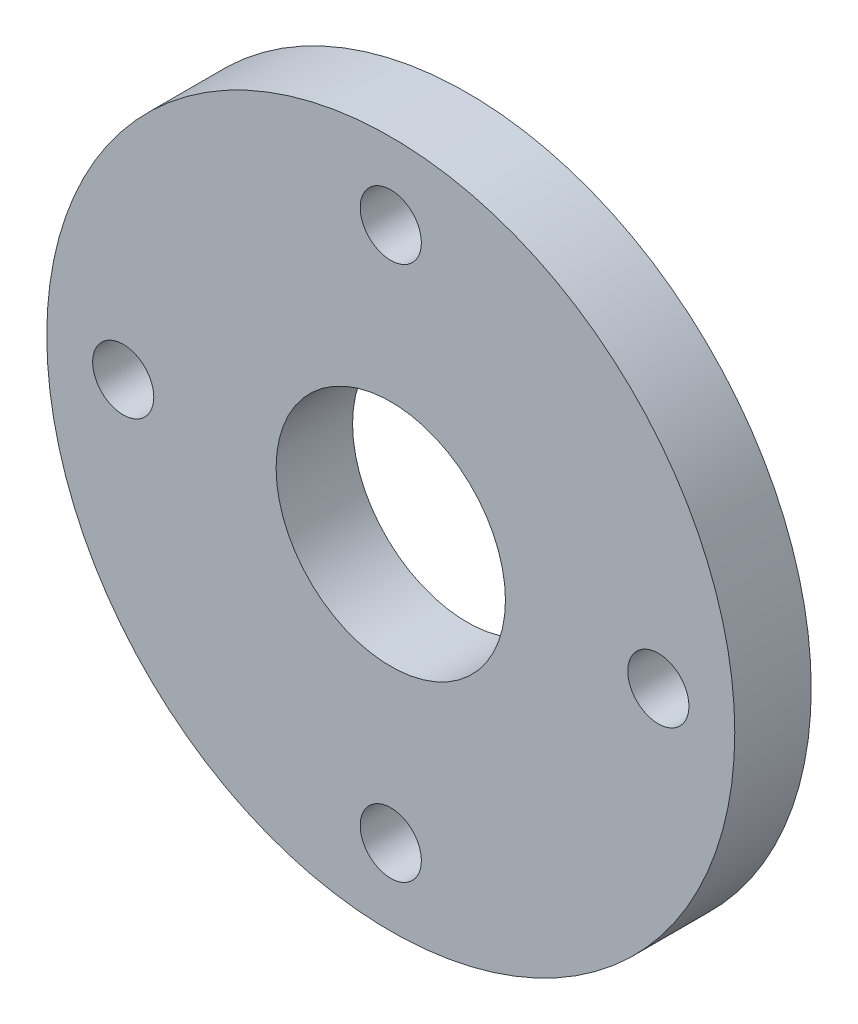
ISO-10303-21;
HEADER;
FILE_DESCRIPTION(('STEP AP214'),'2;1');
FILE_NAME('part.step','',(''),(''),'','','');
FILE_SCHEMA(('AUTOMOTIVE_DESIGN { 1 0 10303 214 1 1 1 1 }'));
ENDSEC;
DATA;
#1=APPLICATION_CONTEXT('core data for automotive mechanical design processes');
#2=APPLICATION_PROTOCOL_DEFINITION('international standard','automotive_design',2000,#1);
#3=PRODUCT_CONTEXT('',#1,'mechanical');
#4=PRODUCT('Part','Part','',(#3));
#5=PRODUCT_RELATED_PRODUCT_CATEGORY('part','',(#4));
#6=PRODUCT_DEFINITION_FORMATION('','',#4);
#7=PRODUCT_DEFINITION_CONTEXT('part definition',#1,'design');
#8=PRODUCT_DEFINITION('design','',#6,#7);
#9=PRODUCT_DEFINITION_SHAPE('','',#8);
#10=(LENGTH_UNIT() NAMED_UNIT(*) SI_UNIT(.MILLI.,.METRE.));
#11=(NAMED_UNIT(*) PLANE_ANGLE_UNIT() SI_UNIT($,.RADIAN.));
#12=(NAMED_UNIT(*) SI_UNIT($,.STERADIAN.) SOLID_ANGLE_UNIT());
#13=UNCERTAINTY_MEASURE_WITH_UNIT(LENGTH_MEASURE(1.E-05),#10,'distance_accuracy_value','');
#14=(GEOMETRIC_REPRESENTATION_CONTEXT(3) GLOBAL_UNCERTAINTY_ASSIGNED_CONTEXT((#13)) GLOBAL_UNIT_ASSIGNED_CONTEXT((#10,
#11,#12)) REPRESENTATION_CONTEXT('',''));
#15=CARTESIAN_POINT('',(0.,0.,0.));
#16=DIRECTION('',(0.,0.,1.));
#17=DIRECTION('',(1.,0.,0.));
#18=AXIS2_PLACEMENT_3D('',#15,#16,#17);
#19=CARTESIAN_POINT('',(0.,0.,5.));
#20=DIRECTION('',(0.,0.,-1.));
#21=DIRECTION('',(-1.,0.,0.));
#22=AXIS2_PLACEMENT_3D('',#19,#20,#21);
#23=CYLINDRICAL_SURFACE('',#22,22.5);
#24=CARTESIAN_POINT('',(0.,0.,5.));
#25=DIRECTION('',(0.,0.,1.));
#26=DIRECTION('',(1.,0.,0.));
#27=AXIS2_PLACEMENT_3D('',#24,#25,#26);
#28=CIRCLE('',#27,22.5);
#29=CARTESIAN_POINT('',(22.5,0.,5.));
#30=VERTEX_POINT('',#29);
#31=EDGE_CURVE('E10',#30,#30,#28,.T.);
#32=ORIENTED_EDGE('',*,*,#31,.F.);
#33=EDGE_LOOP('',(#32));
#34=FACE_BOUND('',#33,.T.);
#35=CARTESIAN_POINT('',(0.,0.,0.));
#36=DIRECTION('',(0.,0.,1.));
#37=DIRECTION('',(1.,0.,0.));
#38=AXIS2_PLACEMENT_3D('',#35,#36,#37);
#39=CIRCLE('',#38,22.5);
#40=CARTESIAN_POINT('',(22.5,0.,0.));
#41=VERTEX_POINT('',#40);
#42=EDGE_CURVE('E40',#41,#41,#39,.T.);
#43=ORIENTED_EDGE('',*,*,#42,.T.);
#44=EDGE_LOOP('',(#43));
#45=FACE_BOUND('',#44,.T.);
#46=ADVANCED_FACE('F37',(#34,#45),#23,.T.);
#47=CARTESIAN_POINT('',(0.,0.,5.));
#48=DIRECTION('',(0.,0.,1.));
#49=DIRECTION('',(1.,0.,0.));
#50=AXIS2_PLACEMENT_3D('',#47,#48,#49);
#51=PLANE('',#50);
#52=CARTESIAN_POINT('',(-17.5,0.,5.));
#53=DIRECTION('',(0.,0.,1.));
#54=DIRECTION('',(1.,0.,0.));
#55=AXIS2_PLACEMENT_3D('',#52,#53,#54);
#56=CIRCLE('',#55,2.);
#57=CARTESIAN_POINT('',(-15.5,0.,5.));
#58=VERTEX_POINT('',#57);
#59=EDGE_CURVE('E55',#58,#58,#56,.T.);
#60=ORIENTED_EDGE('',*,*,#59,.F.);
#61=EDGE_LOOP('',(#60));
#62=FACE_BOUND('',#61,.T.);
#63=CARTESIAN_POINT('',(0.,-17.5,5.));
#64=DIRECTION('',(0.,0.,1.));
#65=DIRECTION('',(1.,0.,0.));
#66=AXIS2_PLACEMENT_3D('',#63,#64,#65);
#67=CIRCLE('',#66,2.);
#68=CARTESIAN_POINT('',(2.,-17.5,5.));
#69=VERTEX_POINT('',#68);
#70=EDGE_CURVE('E62',#69,#69,#67,.T.);
#71=ORIENTED_EDGE('',*,*,#70,.F.);
#72=EDGE_LOOP('',(#71));
#73=FACE_BOUND('',#72,.T.);
#74=CARTESIAN_POINT('',(17.5,0.,5.));
#75=DIRECTION('',(0.,0.,1.));
#76=DIRECTION('',(1.,0.,0.));
#77=AXIS2_PLACEMENT_3D('',#74,#75,#76);
#78=CIRCLE('',#77,2.);
#79=CARTESIAN_POINT('',(19.5,0.,5.));
#80=VERTEX_POINT('',#79);
#81=EDGE_CURVE('E66',#80,#80,#78,.T.);
#82=ORIENTED_EDGE('',*,*,#81,.F.);
#83=EDGE_LOOP('',(#82));
#84=FACE_BOUND('',#83,.T.);
#85=CARTESIAN_POINT('',(0.,17.5,5.));
#86=DIRECTION('',(0.,0.,1.));
#87=DIRECTION('',(1.,0.,0.));
#88=AXIS2_PLACEMENT_3D('',#85,#86,#87);
#89=CIRCLE('',#88,2.);
#90=CARTESIAN_POINT('',(2.,17.5,5.));
#91=VERTEX_POINT('',#90);
#92=EDGE_CURVE('E70',#91,#91,#89,.T.);
#93=ORIENTED_EDGE('',*,*,#92,.F.);
#94=EDGE_LOOP('',(#93));
#95=FACE_BOUND('',#94,.T.);
#96=CARTESIAN_POINT('',(0.,0.,5.));
#97=DIRECTION('',(0.,0.,1.));
#98=DIRECTION('',(1.,0.,0.));
#99=AXIS2_PLACEMENT_3D('',#96,#97,#98);
#100=CIRCLE('',#99,7.5);
#101=CARTESIAN_POINT('',(7.5,0.,5.));
#102=VERTEX_POINT('',#101);
#103=EDGE_CURVE('E51',#102,#102,#100,.T.);
#104=ORIENTED_EDGE('',*,*,#103,.F.);
#105=EDGE_LOOP('',(#104));
#106=FACE_BOUND('',#105,.T.);
#107=ORIENTED_EDGE('',*,*,#31,.T.);
#108=EDGE_LOOP('',(#107));
#109=FACE_BOUND('',#108,.T.);
#110=ADVANCED_FACE('F106',(#62,#73,#84,#95,#106,#109),#51,.T.);
#111=CARTESIAN_POINT('',(0.,0.,0.));
#112=DIRECTION('',(0.,0.,1.));
#113=DIRECTION('',(1.,0.,0.));
#114=AXIS2_PLACEMENT_3D('',#111,#112,#113);
#115=PLANE('',#114);
#116=CARTESIAN_POINT('',(-17.5,0.,0.));
#117=DIRECTION('',(0.,0.,1.));
#118=DIRECTION('',(1.,0.,0.));
#119=AXIS2_PLACEMENT_3D('',#116,#117,#118);
#120=CIRCLE('',#119,2.);
#121=CARTESIAN_POINT('',(-15.5,0.,0.));
#122=VERTEX_POINT('',#121);
#123=EDGE_CURVE('E74',#122,#122,#120,.T.);
#124=ORIENTED_EDGE('',*,*,#123,.T.);
#125=EDGE_LOOP('',(#124));
#126=FACE_BOUND('',#125,.T.);
#127=CARTESIAN_POINT('',(0.,-17.5,0.));
#128=DIRECTION('',(0.,0.,1.));
#129=DIRECTION('',(1.,0.,0.));
#130=AXIS2_PLACEMENT_3D('',#127,#128,#129);
#131=CIRCLE('',#130,2.);
#132=CARTESIAN_POINT('',(2.,-17.5,0.));
#133=VERTEX_POINT('',#132);
#134=EDGE_CURVE('E83',#133,#133,#131,.T.);
#135=ORIENTED_EDGE('',*,*,#134,.T.);
#136=EDGE_LOOP('',(#135));
#137=FACE_BOUND('',#136,.T.);
#138=CARTESIAN_POINT('',(17.5,0.,0.));
#139=DIRECTION('',(0.,0.,1.));
#140=DIRECTION('',(1.,0.,0.));
#141=AXIS2_PLACEMENT_3D('',#138,#139,#140);
#142=CIRCLE('',#141,2.);
#143=CARTESIAN_POINT('',(19.5,0.,0.));
#144=VERTEX_POINT('',#143);
#145=EDGE_CURVE('E79',#144,#144,#142,.T.);
#146=ORIENTED_EDGE('',*,*,#145,.T.);
#147=EDGE_LOOP('',(#146));
#148=FACE_BOUND('',#147,.T.);
#149=CARTESIAN_POINT('',(0.,17.5,0.));
#150=DIRECTION('',(0.,0.,1.));
#151=DIRECTION('',(1.,0.,0.));
#152=AXIS2_PLACEMENT_3D('',#149,#150,#151);
#153=CIRCLE('',#152,2.);
#154=CARTESIAN_POINT('',(2.,17.5,0.));
#155=VERTEX_POINT('',#154);
#156=EDGE_CURVE('E75',#155,#155,#153,.T.);
#157=ORIENTED_EDGE('',*,*,#156,.T.);
#158=EDGE_LOOP('',(#157));
#159=FACE_BOUND('',#158,.T.);
#160=CARTESIAN_POINT('',(0.,0.,0.));
#161=DIRECTION('',(0.,0.,1.));
#162=DIRECTION('',(1.,0.,0.));
#163=AXIS2_PLACEMENT_3D('',#160,#161,#162);
#164=CIRCLE('',#163,7.5);
#165=CARTESIAN_POINT('',(7.5,0.,0.));
#166=VERTEX_POINT('',#165);
#167=EDGE_CURVE('E49',#166,#166,#164,.T.);
#168=ORIENTED_EDGE('',*,*,#167,.T.);
#169=EDGE_LOOP('',(#168));
#170=FACE_BOUND('',#169,.T.);
#171=ORIENTED_EDGE('',*,*,#42,.F.);
#172=EDGE_LOOP('',(#171));
#173=FACE_BOUND('',#172,.T.);
#174=ADVANCED_FACE('F91',(#126,#137,#148,#159,#170,#173),#115,.F.);
#175=CARTESIAN_POINT('',(0.,0.,0.));
#176=DIRECTION('',(0.,0.,1.));
#177=DIRECTION('',(1.,0.,0.));
#178=AXIS2_PLACEMENT_3D('',#175,#176,#177);
#179=CYLINDRICAL_SURFACE('',#178,7.5);
#180=ORIENTED_EDGE('',*,*,#167,.F.);
#181=EDGE_LOOP('',(#180));
#182=FACE_BOUND('',#181,.T.);
#183=ORIENTED_EDGE('',*,*,#103,.T.);
#184=EDGE_LOOP('',(#183));
#185=FACE_BOUND('',#184,.T.);
#186=ADVANCED_FACE('F117',(#182,#185),#179,.F.);
#187=CARTESIAN_POINT('',(0.,17.5,0.));
#188=DIRECTION('',(0.,0.,1.));
#189=DIRECTION('',(1.,0.,0.));
#190=AXIS2_PLACEMENT_3D('',#187,#188,#189);
#191=CYLINDRICAL_SURFACE('',#190,2.);
#192=ORIENTED_EDGE('',*,*,#92,.T.);
#193=EDGE_LOOP('',(#192));
#194=FACE_BOUND('',#193,.T.);
#195=ORIENTED_EDGE('',*,*,#156,.F.);
#196=EDGE_LOOP('',(#195));
#197=FACE_BOUND('',#196,.T.);
#198=ADVANCED_FACE('F121',(#194,#197),#191,.F.);
#199=CARTESIAN_POINT('',(17.5,0.,0.));
#200=DIRECTION('',(0.,0.,1.));
#201=DIRECTION('',(1.,0.,0.));
#202=AXIS2_PLACEMENT_3D('',#199,#200,#201);
#203=CYLINDRICAL_SURFACE('',#202,2.);
#204=ORIENTED_EDGE('',*,*,#81,.T.);
#205=EDGE_LOOP('',(#204));
#206=FACE_BOUND('',#205,.T.);
#207=ORIENTED_EDGE('',*,*,#145,.F.);
#208=EDGE_LOOP('',(#207));
#209=FACE_BOUND('',#208,.T.);
#210=ADVANCED_FACE('F102',(#206,#209),#203,.F.);
#211=CARTESIAN_POINT('',(0.,-17.5,0.));
#212=DIRECTION('',(0.,0.,1.));
#213=DIRECTION('',(1.,0.,0.));
#214=AXIS2_PLACEMENT_3D('',#211,#212,#213);
#215=CYLINDRICAL_SURFACE('',#214,2.);
#216=ORIENTED_EDGE('',*,*,#70,.T.);
#217=EDGE_LOOP('',(#216));
#218=FACE_BOUND('',#217,.T.);
#219=ORIENTED_EDGE('',*,*,#134,.F.);
#220=EDGE_LOOP('',(#219));
#221=FACE_BOUND('',#220,.T.);
#222=ADVANCED_FACE('F96',(#218,#221),#215,.F.);
#223=CARTESIAN_POINT('',(-17.5,0.,0.));
#224=DIRECTION('',(0.,0.,1.));
#225=DIRECTION('',(1.,0.,0.));
#226=AXIS2_PLACEMENT_3D('',#223,#224,#225);
#227=CYLINDRICAL_SURFACE('',#226,2.);
#228=ORIENTED_EDGE('',*,*,#59,.T.);
#229=EDGE_LOOP('',(#228));
#230=FACE_BOUND('',#229,.T.);
#231=ORIENTED_EDGE('',*,*,#123,.F.);
#232=EDGE_LOOP('',(#231));
#233=FACE_BOUND('',#232,.T.);
#234=ADVANCED_FACE('F94',(#230,#233),#227,.F.);
#235=CLOSED_SHELL('',(#46,#110,#174,#186,#198,#210,#222,#234));
#236=MANIFOLD_SOLID_BREP('B2',#235);
#237=ADVANCED_BREP_SHAPE_REPRESENTATION('',(#18,#236),#14);
#238=SHAPE_DEFINITION_REPRESENTATION(#9,#237);
ENDSEC;
END-ISO-10303-21;
